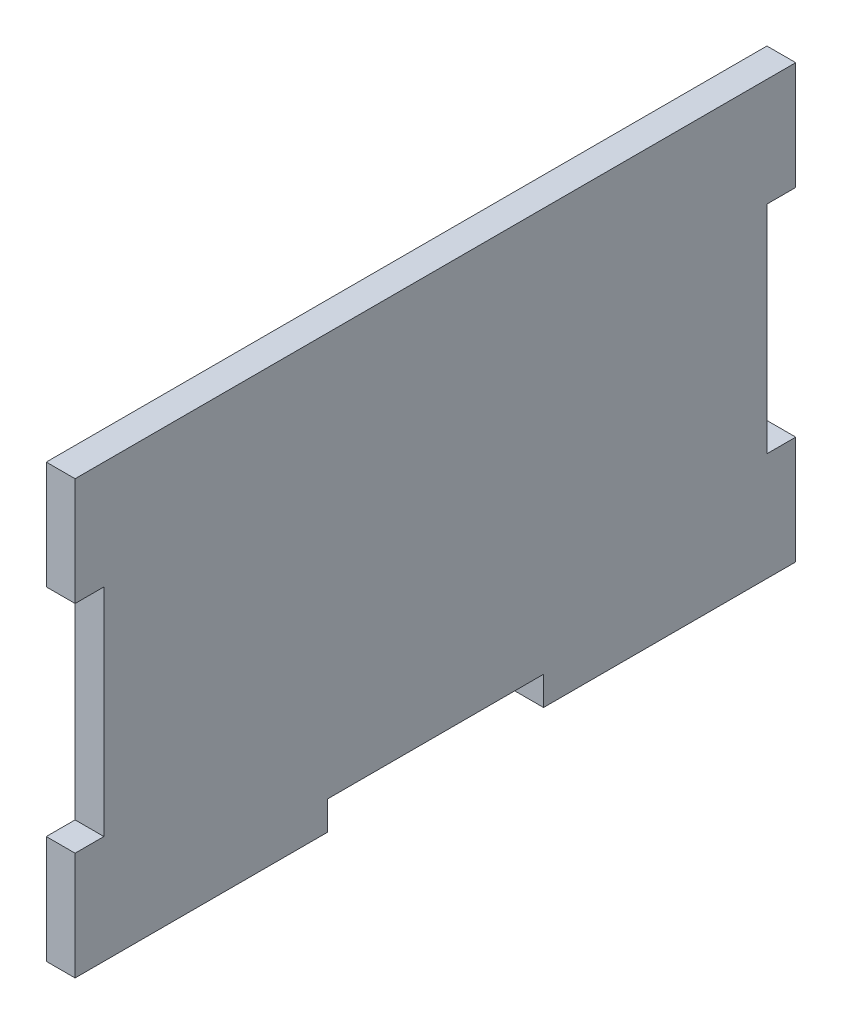
ISO-10303-21;
HEADER;
FILE_DESCRIPTION(('STEP AP214'),'2;1');
FILE_NAME('part.step','',(''),(''),'','','');
FILE_SCHEMA(('AUTOMOTIVE_DESIGN { 1 0 10303 214 1 1 1 1 }'));
ENDSEC;
DATA;
#1=APPLICATION_CONTEXT('core data for automotive mechanical design processes');
#2=APPLICATION_PROTOCOL_DEFINITION('international standard','automotive_design',2000,#1);
#3=PRODUCT_CONTEXT('',#1,'mechanical');
#4=PRODUCT('Part','Part','',(#3));
#5=PRODUCT_RELATED_PRODUCT_CATEGORY('part','',(#4));
#6=PRODUCT_DEFINITION_FORMATION('','',#4);
#7=PRODUCT_DEFINITION_CONTEXT('part definition',#1,'design');
#8=PRODUCT_DEFINITION('design','',#6,#7);
#9=PRODUCT_DEFINITION_SHAPE('','',#8);
#10=(LENGTH_UNIT() NAMED_UNIT(*) SI_UNIT(.MILLI.,.METRE.));
#11=(NAMED_UNIT(*) PLANE_ANGLE_UNIT() SI_UNIT($,.RADIAN.));
#12=(NAMED_UNIT(*) SI_UNIT($,.STERADIAN.) SOLID_ANGLE_UNIT());
#13=UNCERTAINTY_MEASURE_WITH_UNIT(LENGTH_MEASURE(1.E-05),#10,'distance_accuracy_value','');
#14=(GEOMETRIC_REPRESENTATION_CONTEXT(3) GLOBAL_UNCERTAINTY_ASSIGNED_CONTEXT((#13)) GLOBAL_UNIT_ASSIGNED_CONTEXT((#10,
#11,#12)) REPRESENTATION_CONTEXT('',''));
#15=CARTESIAN_POINT('',(0.,0.,0.));
#16=DIRECTION('',(0.,0.,1.));
#17=DIRECTION('',(1.,0.,0.));
#18=AXIS2_PLACEMENT_3D('',#15,#16,#17);
#19=CARTESIAN_POINT('',(2.,0.,0.));
#20=DIRECTION('',(0.,1.,0.));
#21=DIRECTION('',(0.,0.,1.));
#22=AXIS2_PLACEMENT_3D('',#19,#20,#21);
#23=PLANE('',#22);
#24=DIRECTION('',(0.,0.,-1.));
#25=VECTOR('',#24,1.);
#26=CARTESIAN_POINT('',(2.,0.,0.));
#27=LINE('',#26,#25);
#28=CARTESIAN_POINT('',(2.,0.,-32.5026150592213));
#29=VERTEX_POINT('',#28);
#30=CARTESIAN_POINT('',(2.,0.,-50.));
#31=VERTEX_POINT('',#30);
#32=EDGE_CURVE('E234',#29,#31,#27,.T.);
#33=ORIENTED_EDGE('',*,*,#32,.F.);
#34=DIRECTION('',(1.,0.,0.));
#35=VECTOR('',#34,1.);
#36=CARTESIAN_POINT('',(0.,0.,-32.5026150592213));
#37=LINE('',#36,#35);
#38=CARTESIAN_POINT('',(0.,0.,-32.5026150592213));
#39=VERTEX_POINT('',#38);
#40=EDGE_CURVE('E174',#39,#29,#37,.T.);
#41=ORIENTED_EDGE('',*,*,#40,.F.);
#42=DIRECTION('',(0.,0.,-1.));
#43=VECTOR('',#42,1.);
#44=CARTESIAN_POINT('',(0.,0.,0.));
#45=LINE('',#44,#43);
#46=CARTESIAN_POINT('',(0.,0.,-50.));
#47=VERTEX_POINT('',#46);
#48=EDGE_CURVE('E165',#39,#47,#45,.T.);
#49=ORIENTED_EDGE('',*,*,#48,.T.);
#50=DIRECTION('',(-1.,0.,0.));
#51=VECTOR('',#50,1.);
#52=CARTESIAN_POINT('',(2.,0.,-50.));
#53=LINE('',#52,#51);
#54=EDGE_CURVE('E40',#31,#47,#53,.T.);
#55=ORIENTED_EDGE('',*,*,#54,.F.);
#56=EDGE_LOOP('',(#33,#41,#49,#55));
#57=FACE_BOUND('',#56,.T.);
#58=ADVANCED_FACE('F32',(#57),#23,.F.);
#59=CARTESIAN_POINT('',(2.,0.,0.));
#60=DIRECTION('',(0.,0.,-1.));
#61=DIRECTION('',(-1.,0.,0.));
#62=AXIS2_PLACEMENT_3D('',#59,#60,#61);
#63=PLANE('',#62);
#64=DIRECTION('',(0.,-1.,0.));
#65=VECTOR('',#64,1.);
#66=CARTESIAN_POINT('',(2.,0.,0.));
#67=LINE('',#66,#65);
#68=CARTESIAN_POINT('',(2.,7.5,0.));
#69=VERTEX_POINT('',#68);
#70=CARTESIAN_POINT('',(2.,0.,0.));
#71=VERTEX_POINT('',#70);
#72=EDGE_CURVE('E235',#69,#71,#67,.T.);
#73=ORIENTED_EDGE('',*,*,#72,.F.);
#74=DIRECTION('',(1.,0.,0.));
#75=VECTOR('',#74,1.);
#76=CARTESIAN_POINT('',(0.,7.5,0.));
#77=LINE('',#76,#75);
#78=CARTESIAN_POINT('',(0.,7.5,0.));
#79=VERTEX_POINT('',#78);
#80=EDGE_CURVE('E198',#79,#69,#77,.T.);
#81=ORIENTED_EDGE('',*,*,#80,.F.);
#82=DIRECTION('',(0.,-1.,0.));
#83=VECTOR('',#82,1.);
#84=CARTESIAN_POINT('',(0.,0.,0.));
#85=LINE('',#84,#83);
#86=CARTESIAN_POINT('',(0.,0.,0.));
#87=VERTEX_POINT('',#86);
#88=EDGE_CURVE('E200',#79,#87,#85,.T.);
#89=ORIENTED_EDGE('',*,*,#88,.T.);
#90=DIRECTION('',(-1.,0.,0.));
#91=VECTOR('',#90,1.);
#92=CARTESIAN_POINT('',(2.,0.,0.));
#93=LINE('',#92,#91);
#94=EDGE_CURVE('E11',#71,#87,#93,.T.);
#95=ORIENTED_EDGE('',*,*,#94,.F.);
#96=EDGE_LOOP('',(#73,#81,#89,#95));
#97=FACE_BOUND('',#96,.T.);
#98=ADVANCED_FACE('F281',(#97),#63,.F.);
#99=CARTESIAN_POINT('',(2.,0.,-50.));
#100=DIRECTION('',(0.,0.,1.));
#101=DIRECTION('',(1.,0.,0.));
#102=AXIS2_PLACEMENT_3D('',#99,#100,#101);
#103=PLANE('',#102);
#104=DIRECTION('',(0.,1.,0.));
#105=VECTOR('',#104,1.);
#106=CARTESIAN_POINT('',(2.,0.,-50.));
#107=LINE('',#106,#105);
#108=CARTESIAN_POINT('',(2.,22.5,-50.));
#109=VERTEX_POINT('',#108);
#110=CARTESIAN_POINT('',(2.,30.,-50.));
#111=VERTEX_POINT('',#110);
#112=EDGE_CURVE('E239',#109,#111,#107,.T.);
#113=ORIENTED_EDGE('',*,*,#112,.F.);
#114=DIRECTION('',(1.,0.,0.));
#115=VECTOR('',#114,1.);
#116=CARTESIAN_POINT('',(0.,22.5,-50.));
#117=LINE('',#116,#115);
#118=CARTESIAN_POINT('',(0.,22.5,-50.));
#119=VERTEX_POINT('',#118);
#120=EDGE_CURVE('E194',#119,#109,#117,.T.);
#121=ORIENTED_EDGE('',*,*,#120,.F.);
#122=DIRECTION('',(0.,1.,0.));
#123=VECTOR('',#122,1.);
#124=CARTESIAN_POINT('',(0.,0.,-50.));
#125=LINE('',#124,#123);
#126=CARTESIAN_POINT('',(0.,30.,-50.));
#127=VERTEX_POINT('',#126);
#128=EDGE_CURVE('E252',#119,#127,#125,.T.);
#129=ORIENTED_EDGE('',*,*,#128,.T.);
#130=DIRECTION('',(-1.,0.,0.));
#131=VECTOR('',#130,1.);
#132=CARTESIAN_POINT('',(2.,30.,-50.));
#133=LINE('',#132,#131);
#134=EDGE_CURVE('E260',#111,#127,#133,.T.);
#135=ORIENTED_EDGE('',*,*,#134,.F.);
#136=EDGE_LOOP('',(#113,#121,#129,#135));
#137=FACE_BOUND('',#136,.T.);
#138=ADVANCED_FACE('F286',(#137),#103,.F.);
#139=CARTESIAN_POINT('',(0.,30.,0.));
#140=VERTEX_POINT('',#139);
#141=CARTESIAN_POINT('',(0.,22.5,0.));
#142=VERTEX_POINT('',#141);
#143=EDGE_CURVE('E246',#140,#142,#85,.T.);
#144=ORIENTED_EDGE('',*,*,#143,.T.);
#145=DIRECTION('',(1.,0.,0.));
#146=VECTOR('',#145,1.);
#147=CARTESIAN_POINT('',(0.,22.5,0.));
#148=LINE('',#147,#146);
#149=CARTESIAN_POINT('',(2.,22.5,0.));
#150=VERTEX_POINT('',#149);
#151=EDGE_CURVE('E201',#142,#150,#148,.T.);
#152=ORIENTED_EDGE('',*,*,#151,.T.);
#153=CARTESIAN_POINT('',(2.,30.,0.));
#154=VERTEX_POINT('',#153);
#155=EDGE_CURVE('E231',#154,#150,#67,.T.);
#156=ORIENTED_EDGE('',*,*,#155,.F.);
#157=DIRECTION('',(-1.,0.,0.));
#158=VECTOR('',#157,1.);
#159=CARTESIAN_POINT('',(2.,30.,0.));
#160=LINE('',#159,#158);
#161=EDGE_CURVE('E245',#154,#140,#160,.T.);
#162=ORIENTED_EDGE('',*,*,#161,.T.);
#163=EDGE_LOOP('',(#144,#152,#156,#162));
#164=FACE_BOUND('',#163,.T.);
#165=ADVANCED_FACE('F34',(#164),#63,.F.);
#166=CARTESIAN_POINT('',(0.,0.,-17.4973849407786));
#167=VERTEX_POINT('',#166);
#168=EDGE_CURVE('E249',#87,#167,#45,.T.);
#169=ORIENTED_EDGE('',*,*,#168,.T.);
#170=DIRECTION('',(1.,0.,0.));
#171=VECTOR('',#170,1.);
#172=CARTESIAN_POINT('',(0.,0.,-17.4973849407786));
#173=LINE('',#172,#171);
#174=CARTESIAN_POINT('',(2.,0.,-17.4973849407786));
#175=VERTEX_POINT('',#174);
#176=EDGE_CURVE('E177',#167,#175,#173,.T.);
#177=ORIENTED_EDGE('',*,*,#176,.T.);
#178=EDGE_CURVE('E236',#71,#175,#27,.T.);
#179=ORIENTED_EDGE('',*,*,#178,.F.);
#180=ORIENTED_EDGE('',*,*,#94,.T.);
#181=EDGE_LOOP('',(#169,#177,#179,#180));
#182=FACE_BOUND('',#181,.T.);
#183=ADVANCED_FACE('F282',(#182),#23,.F.);
#184=CARTESIAN_POINT('',(0.,7.49999999999998,-50.));
#185=VERTEX_POINT('',#184);
#186=EDGE_CURVE('E253',#47,#185,#125,.T.);
#187=ORIENTED_EDGE('',*,*,#186,.T.);
#188=DIRECTION('',(1.,0.,0.));
#189=VECTOR('',#188,1.);
#190=CARTESIAN_POINT('',(0.,7.49999999999998,-50.));
#191=LINE('',#190,#189);
#192=CARTESIAN_POINT('',(2.,7.49999999999998,-50.));
#193=VERTEX_POINT('',#192);
#194=EDGE_CURVE('E225',#185,#193,#191,.T.);
#195=ORIENTED_EDGE('',*,*,#194,.T.);
#196=EDGE_CURVE('E240',#31,#193,#107,.T.);
#197=ORIENTED_EDGE('',*,*,#196,.F.);
#198=ORIENTED_EDGE('',*,*,#54,.T.);
#199=EDGE_LOOP('',(#187,#195,#197,#198));
#200=FACE_BOUND('',#199,.T.);
#201=ADVANCED_FACE('F266',(#200),#103,.F.);
#202=CARTESIAN_POINT('',(2.,30.,0.));
#203=DIRECTION('',(0.,-1.,0.));
#204=DIRECTION('',(0.,0.,-1.));
#205=AXIS2_PLACEMENT_3D('',#202,#203,#204);
#206=PLANE('',#205);
#207=DIRECTION('',(0.,0.,1.));
#208=VECTOR('',#207,1.);
#209=CARTESIAN_POINT('',(0.,30.,0.));
#210=LINE('',#209,#208);
#211=EDGE_CURVE('E256',#127,#140,#210,.T.);
#212=ORIENTED_EDGE('',*,*,#211,.T.);
#213=ORIENTED_EDGE('',*,*,#161,.F.);
#214=DIRECTION('',(0.,0.,1.));
#215=VECTOR('',#214,1.);
#216=CARTESIAN_POINT('',(2.,30.,0.));
#217=LINE('',#216,#215);
#218=EDGE_CURVE('E243',#111,#154,#217,.T.);
#219=ORIENTED_EDGE('',*,*,#218,.F.);
#220=ORIENTED_EDGE('',*,*,#134,.T.);
#221=EDGE_LOOP('',(#212,#213,#219,#220));
#222=FACE_BOUND('',#221,.T.);
#223=ADVANCED_FACE('F295',(#222),#206,.F.);
#224=CARTESIAN_POINT('',(2.,0.,0.));
#225=DIRECTION('',(-1.,0.,0.));
#226=DIRECTION('',(0.,0.,1.));
#227=AXIS2_PLACEMENT_3D('',#224,#225,#226);
#228=PLANE('',#227);
#229=DIRECTION('',(0.,0.,1.));
#230=VECTOR('',#229,1.);
#231=CARTESIAN_POINT('',(2.,2.,-17.4973849407786));
#232=LINE('',#231,#230);
#233=CARTESIAN_POINT('',(2.,1.99999999999999,-32.5026150592213));
#234=VERTEX_POINT('',#233);
#235=CARTESIAN_POINT('',(2.,2.,-17.4973849407786));
#236=VERTEX_POINT('',#235);
#237=EDGE_CURVE('E168',#234,#236,#232,.T.);
#238=ORIENTED_EDGE('',*,*,#237,.F.);
#239=DIRECTION('',(0.,1.,0.));
#240=VECTOR('',#239,1.);
#241=CARTESIAN_POINT('',(2.,0.,-32.5026150592213));
#242=LINE('',#241,#240);
#243=EDGE_CURVE('E151',#29,#234,#242,.T.);
#244=ORIENTED_EDGE('',*,*,#243,.F.);
#245=ORIENTED_EDGE('',*,*,#32,.T.);
#246=ORIENTED_EDGE('',*,*,#196,.T.);
#247=DIRECTION('',(0.,0.,-1.));
#248=VECTOR('',#247,1.);
#249=CARTESIAN_POINT('',(2.,7.49999999999998,-50.));
#250=LINE('',#249,#248);
#251=CARTESIAN_POINT('',(2.,7.49999999999998,-48.));
#252=VERTEX_POINT('',#251);
#253=EDGE_CURVE('E211',#252,#193,#250,.T.);
#254=ORIENTED_EDGE('',*,*,#253,.F.);
#255=DIRECTION('',(0.,-1.,0.));
#256=VECTOR('',#255,1.);
#257=CARTESIAN_POINT('',(2.,22.5,-48.));
#258=LINE('',#257,#256);
#259=CARTESIAN_POINT('',(2.,22.5,-48.));
#260=VERTEX_POINT('',#259);
#261=EDGE_CURVE('E220',#260,#252,#258,.T.);
#262=ORIENTED_EDGE('',*,*,#261,.F.);
#263=DIRECTION('',(0.,0.,1.));
#264=VECTOR('',#263,1.);
#265=CARTESIAN_POINT('',(2.,22.5,-50.));
#266=LINE('',#265,#264);
#267=EDGE_CURVE('E176',#109,#260,#266,.T.);
#268=ORIENTED_EDGE('',*,*,#267,.F.);
#269=ORIENTED_EDGE('',*,*,#112,.T.);
#270=ORIENTED_EDGE('',*,*,#218,.T.);
#271=ORIENTED_EDGE('',*,*,#155,.T.);
#272=DIRECTION('',(0.,0.,1.));
#273=VECTOR('',#272,1.);
#274=CARTESIAN_POINT('',(2.,22.5,0.));
#275=LINE('',#274,#273);
#276=CARTESIAN_POINT('',(2.,22.5,-2.));
#277=VERTEX_POINT('',#276);
#278=EDGE_CURVE('E185',#277,#150,#275,.T.);
#279=ORIENTED_EDGE('',*,*,#278,.F.);
#280=DIRECTION('',(0.,1.,0.));
#281=VECTOR('',#280,1.);
#282=CARTESIAN_POINT('',(2.,22.5,-2.));
#283=LINE('',#282,#281);
#284=CARTESIAN_POINT('',(2.,7.5,-2.));
#285=VERTEX_POINT('',#284);
#286=EDGE_CURVE('E193',#285,#277,#283,.T.);
#287=ORIENTED_EDGE('',*,*,#286,.F.);
#288=DIRECTION('',(0.,0.,-1.));
#289=VECTOR('',#288,1.);
#290=CARTESIAN_POINT('',(2.,7.5,0.));
#291=LINE('',#290,#289);
#292=EDGE_CURVE('E190',#69,#285,#291,.T.);
#293=ORIENTED_EDGE('',*,*,#292,.F.);
#294=ORIENTED_EDGE('',*,*,#72,.T.);
#295=ORIENTED_EDGE('',*,*,#178,.T.);
#296=DIRECTION('',(0.,-1.,0.));
#297=VECTOR('',#296,1.);
#298=CARTESIAN_POINT('',(2.,0.,-17.4973849407786));
#299=LINE('',#298,#297);
#300=EDGE_CURVE('E166',#236,#175,#299,.T.);
#301=ORIENTED_EDGE('',*,*,#300,.F.);
#302=EDGE_LOOP('',(#238,#244,#245,#246,#254,#262,#268,#269,#270,#271,#279,#287,#293,#294,#295,#301));
#303=FACE_BOUND('',#302,.T.);
#304=ADVANCED_FACE('F279',(#303),#228,.F.);
#305=CARTESIAN_POINT('',(0.,0.,0.));
#306=DIRECTION('',(-1.,0.,0.));
#307=DIRECTION('',(0.,0.,1.));
#308=AXIS2_PLACEMENT_3D('',#305,#306,#307);
#309=PLANE('',#308);
#310=DIRECTION('',(0.,1.,0.));
#311=VECTOR('',#310,1.);
#312=CARTESIAN_POINT('',(0.,0.,-32.5026150592213));
#313=LINE('',#312,#311);
#314=CARTESIAN_POINT('',(0.,1.99999999999999,-32.5026150592213));
#315=VERTEX_POINT('',#314);
#316=EDGE_CURVE('E148',#39,#315,#313,.T.);
#317=ORIENTED_EDGE('',*,*,#316,.T.);
#318=DIRECTION('',(0.,0.,1.));
#319=VECTOR('',#318,1.);
#320=CARTESIAN_POINT('',(0.,2.,-17.4973849407786));
#321=LINE('',#320,#319);
#322=CARTESIAN_POINT('',(0.,2.,-17.4973849407786));
#323=VERTEX_POINT('',#322);
#324=EDGE_CURVE('E158',#315,#323,#321,.T.);
#325=ORIENTED_EDGE('',*,*,#324,.T.);
#326=DIRECTION('',(0.,-1.,0.));
#327=VECTOR('',#326,1.);
#328=CARTESIAN_POINT('',(0.,0.,-17.4973849407786));
#329=LINE('',#328,#327);
#330=EDGE_CURVE('E47',#323,#167,#329,.T.);
#331=ORIENTED_EDGE('',*,*,#330,.T.);
#332=ORIENTED_EDGE('',*,*,#168,.F.);
#333=ORIENTED_EDGE('',*,*,#88,.F.);
#334=DIRECTION('',(0.,0.,-1.));
#335=VECTOR('',#334,1.);
#336=CARTESIAN_POINT('',(0.,7.5,0.));
#337=LINE('',#336,#335);
#338=CARTESIAN_POINT('',(0.,7.5,-2.));
#339=VERTEX_POINT('',#338);
#340=EDGE_CURVE('E181',#79,#339,#337,.T.);
#341=ORIENTED_EDGE('',*,*,#340,.T.);
#342=DIRECTION('',(0.,1.,0.));
#343=VECTOR('',#342,1.);
#344=CARTESIAN_POINT('',(0.,22.5,-2.));
#345=LINE('',#344,#343);
#346=CARTESIAN_POINT('',(0.,22.5,-2.));
#347=VERTEX_POINT('',#346);
#348=EDGE_CURVE('E184',#339,#347,#345,.T.);
#349=ORIENTED_EDGE('',*,*,#348,.T.);
#350=DIRECTION('',(0.,0.,1.));
#351=VECTOR('',#350,1.);
#352=CARTESIAN_POINT('',(0.,22.5,0.));
#353=LINE('',#352,#351);
#354=EDGE_CURVE('E55',#347,#142,#353,.T.);
#355=ORIENTED_EDGE('',*,*,#354,.T.);
#356=ORIENTED_EDGE('',*,*,#143,.F.);
#357=ORIENTED_EDGE('',*,*,#211,.F.);
#358=ORIENTED_EDGE('',*,*,#128,.F.);
#359=DIRECTION('',(0.,0.,1.));
#360=VECTOR('',#359,1.);
#361=CARTESIAN_POINT('',(0.,22.5,-50.));
#362=LINE('',#361,#360);
#363=CARTESIAN_POINT('',(0.,22.5,-48.));
#364=VERTEX_POINT('',#363);
#365=EDGE_CURVE('E207',#119,#364,#362,.T.);
#366=ORIENTED_EDGE('',*,*,#365,.T.);
#367=DIRECTION('',(0.,-1.,0.));
#368=VECTOR('',#367,1.);
#369=CARTESIAN_POINT('',(0.,22.5,-48.));
#370=LINE('',#369,#368);
#371=CARTESIAN_POINT('',(0.,7.49999999999998,-48.));
#372=VERTEX_POINT('',#371);
#373=EDGE_CURVE('E210',#364,#372,#370,.T.);
#374=ORIENTED_EDGE('',*,*,#373,.T.);
#375=DIRECTION('',(0.,0.,-1.));
#376=VECTOR('',#375,1.);
#377=CARTESIAN_POINT('',(0.,7.49999999999998,-50.));
#378=LINE('',#377,#376);
#379=EDGE_CURVE('E214',#372,#185,#378,.T.);
#380=ORIENTED_EDGE('',*,*,#379,.T.);
#381=ORIENTED_EDGE('',*,*,#186,.F.);
#382=ORIENTED_EDGE('',*,*,#48,.F.);
#383=EDGE_LOOP('',(#317,#325,#331,#332,#333,#341,#349,#355,#356,#357,#358,#366,#374,#380,#381,#382));
#384=FACE_BOUND('',#383,.T.);
#385=ADVANCED_FACE('F163',(#384),#309,.T.);
#386=CARTESIAN_POINT('',(0.,22.5,-50.));
#387=DIRECTION('',(0.,1.,0.));
#388=DIRECTION('',(0.,0.,1.));
#389=AXIS2_PLACEMENT_3D('',#386,#387,#388);
#390=PLANE('',#389);
#391=ORIENTED_EDGE('',*,*,#267,.T.);
#392=DIRECTION('',(1.,0.,0.));
#393=VECTOR('',#392,1.);
#394=CARTESIAN_POINT('',(0.,22.5,-48.));
#395=LINE('',#394,#393);
#396=EDGE_CURVE('E217',#364,#260,#395,.T.);
#397=ORIENTED_EDGE('',*,*,#396,.F.);
#398=ORIENTED_EDGE('',*,*,#365,.F.);
#399=ORIENTED_EDGE('',*,*,#120,.T.);
#400=EDGE_LOOP('',(#391,#397,#398,#399));
#401=FACE_BOUND('',#400,.T.);
#402=ADVANCED_FACE('F323',(#401),#390,.F.);
#403=CARTESIAN_POINT('',(0.,7.49999999999998,-50.));
#404=DIRECTION('',(0.,-1.,0.));
#405=DIRECTION('',(0.,0.,-1.));
#406=AXIS2_PLACEMENT_3D('',#403,#404,#405);
#407=PLANE('',#406);
#408=ORIENTED_EDGE('',*,*,#253,.T.);
#409=ORIENTED_EDGE('',*,*,#194,.F.);
#410=ORIENTED_EDGE('',*,*,#379,.F.);
#411=DIRECTION('',(1.,0.,0.));
#412=VECTOR('',#411,1.);
#413=CARTESIAN_POINT('',(0.,7.49999999999998,-48.));
#414=LINE('',#413,#412);
#415=EDGE_CURVE('E228',#372,#252,#414,.T.);
#416=ORIENTED_EDGE('',*,*,#415,.T.);
#417=EDGE_LOOP('',(#408,#409,#410,#416));
#418=FACE_BOUND('',#417,.T.);
#419=ADVANCED_FACE('F272',(#418),#407,.F.);
#420=CARTESIAN_POINT('',(0.,22.5,-48.));
#421=DIRECTION('',(0.,0.,1.));
#422=DIRECTION('',(0.,-1.,0.));
#423=AXIS2_PLACEMENT_3D('',#420,#421,#422);
#424=PLANE('',#423);
#425=ORIENTED_EDGE('',*,*,#261,.T.);
#426=ORIENTED_EDGE('',*,*,#415,.F.);
#427=ORIENTED_EDGE('',*,*,#373,.F.);
#428=ORIENTED_EDGE('',*,*,#396,.T.);
#429=EDGE_LOOP('',(#425,#426,#427,#428));
#430=FACE_BOUND('',#429,.T.);
#431=ADVANCED_FACE('F274',(#430),#424,.F.);
#432=CARTESIAN_POINT('',(0.,7.5,0.));
#433=DIRECTION('',(0.,-1.,0.));
#434=DIRECTION('',(0.,0.,-1.));
#435=AXIS2_PLACEMENT_3D('',#432,#433,#434);
#436=PLANE('',#435);
#437=ORIENTED_EDGE('',*,*,#292,.T.);
#438=DIRECTION('',(1.,0.,0.));
#439=VECTOR('',#438,1.);
#440=CARTESIAN_POINT('',(0.,7.5,-2.));
#441=LINE('',#440,#439);
#442=EDGE_CURVE('E189',#339,#285,#441,.T.);
#443=ORIENTED_EDGE('',*,*,#442,.F.);
#444=ORIENTED_EDGE('',*,*,#340,.F.);
#445=ORIENTED_EDGE('',*,*,#80,.T.);
#446=EDGE_LOOP('',(#437,#443,#444,#445));
#447=FACE_BOUND('',#446,.T.);
#448=ADVANCED_FACE('F305',(#447),#436,.F.);
#449=CARTESIAN_POINT('',(0.,22.5,0.));
#450=DIRECTION('',(0.,1.,0.));
#451=DIRECTION('',(0.,0.,1.));
#452=AXIS2_PLACEMENT_3D('',#449,#450,#451);
#453=PLANE('',#452);
#454=ORIENTED_EDGE('',*,*,#278,.T.);
#455=ORIENTED_EDGE('',*,*,#151,.F.);
#456=ORIENTED_EDGE('',*,*,#354,.F.);
#457=DIRECTION('',(1.,0.,0.));
#458=VECTOR('',#457,1.);
#459=CARTESIAN_POINT('',(0.,22.5,-2.));
#460=LINE('',#459,#458);
#461=EDGE_CURVE('E204',#347,#277,#460,.T.);
#462=ORIENTED_EDGE('',*,*,#461,.T.);
#463=EDGE_LOOP('',(#454,#455,#456,#462));
#464=FACE_BOUND('',#463,.T.);
#465=ADVANCED_FACE('F383',(#464),#453,.F.);
#466=CARTESIAN_POINT('',(0.,22.5,-2.));
#467=DIRECTION('',(0.,0.,-1.));
#468=DIRECTION('',(0.,1.,0.));
#469=AXIS2_PLACEMENT_3D('',#466,#467,#468);
#470=PLANE('',#469);
#471=ORIENTED_EDGE('',*,*,#286,.T.);
#472=ORIENTED_EDGE('',*,*,#461,.F.);
#473=ORIENTED_EDGE('',*,*,#348,.F.);
#474=ORIENTED_EDGE('',*,*,#442,.T.);
#475=EDGE_LOOP('',(#471,#472,#473,#474));
#476=FACE_BOUND('',#475,.T.);
#477=ADVANCED_FACE('F309',(#476),#470,.F.);
#478=CARTESIAN_POINT('',(0.,0.,-32.5026150592213));
#479=DIRECTION('',(0.,0.,-1.));
#480=DIRECTION('',(-1.,0.,0.));
#481=AXIS2_PLACEMENT_3D('',#478,#479,#480);
#482=PLANE('',#481);
#483=ORIENTED_EDGE('',*,*,#243,.T.);
#484=DIRECTION('',(1.,0.,0.));
#485=VECTOR('',#484,1.);
#486=CARTESIAN_POINT('',(0.,1.99999999999999,-32.5026150592213));
#487=LINE('',#486,#485);
#488=EDGE_CURVE('E144',#315,#234,#487,.T.);
#489=ORIENTED_EDGE('',*,*,#488,.F.);
#490=ORIENTED_EDGE('',*,*,#316,.F.);
#491=ORIENTED_EDGE('',*,*,#40,.T.);
#492=EDGE_LOOP('',(#483,#489,#490,#491));
#493=FACE_BOUND('',#492,.T.);
#494=ADVANCED_FACE('F146',(#493),#482,.F.);
#495=CARTESIAN_POINT('',(0.,0.,-17.4973849407786));
#496=DIRECTION('',(0.,0.,1.));
#497=DIRECTION('',(1.,0.,0.));
#498=AXIS2_PLACEMENT_3D('',#495,#496,#497);
#499=PLANE('',#498);
#500=ORIENTED_EDGE('',*,*,#300,.T.);
#501=ORIENTED_EDGE('',*,*,#176,.F.);
#502=ORIENTED_EDGE('',*,*,#330,.F.);
#503=DIRECTION('',(1.,0.,0.));
#504=VECTOR('',#503,1.);
#505=CARTESIAN_POINT('',(0.,2.,-17.4973849407786));
#506=LINE('',#505,#504);
#507=EDGE_CURVE('E155',#323,#236,#506,.T.);
#508=ORIENTED_EDGE('',*,*,#507,.T.);
#509=EDGE_LOOP('',(#500,#501,#502,#508));
#510=FACE_BOUND('',#509,.T.);
#511=ADVANCED_FACE('F360',(#510),#499,.F.);
#512=CARTESIAN_POINT('',(0.,2.,-17.4973849407786));
#513=DIRECTION('',(0.,1.,0.));
#514=DIRECTION('',(0.,0.,1.));
#515=AXIS2_PLACEMENT_3D('',#512,#513,#514);
#516=PLANE('',#515);
#517=ORIENTED_EDGE('',*,*,#237,.T.);
#518=ORIENTED_EDGE('',*,*,#507,.F.);
#519=ORIENTED_EDGE('',*,*,#324,.F.);
#520=ORIENTED_EDGE('',*,*,#488,.T.);
#521=EDGE_LOOP('',(#517,#518,#519,#520));
#522=FACE_BOUND('',#521,.T.);
#523=ADVANCED_FACE('F159',(#522),#516,.F.);
#524=CLOSED_SHELL('',(#58,#98,#138,#165,#183,#201,#223,#304,#385,#402,#419,#431,#448,#465,#477,
#494,#511,#523));
#525=MANIFOLD_SOLID_BREP('B2',#524);
#526=ADVANCED_BREP_SHAPE_REPRESENTATION('',(#18,#525),#14);
#527=SHAPE_DEFINITION_REPRESENTATION(#9,#526);
ENDSEC;
END-ISO-10303-21;
